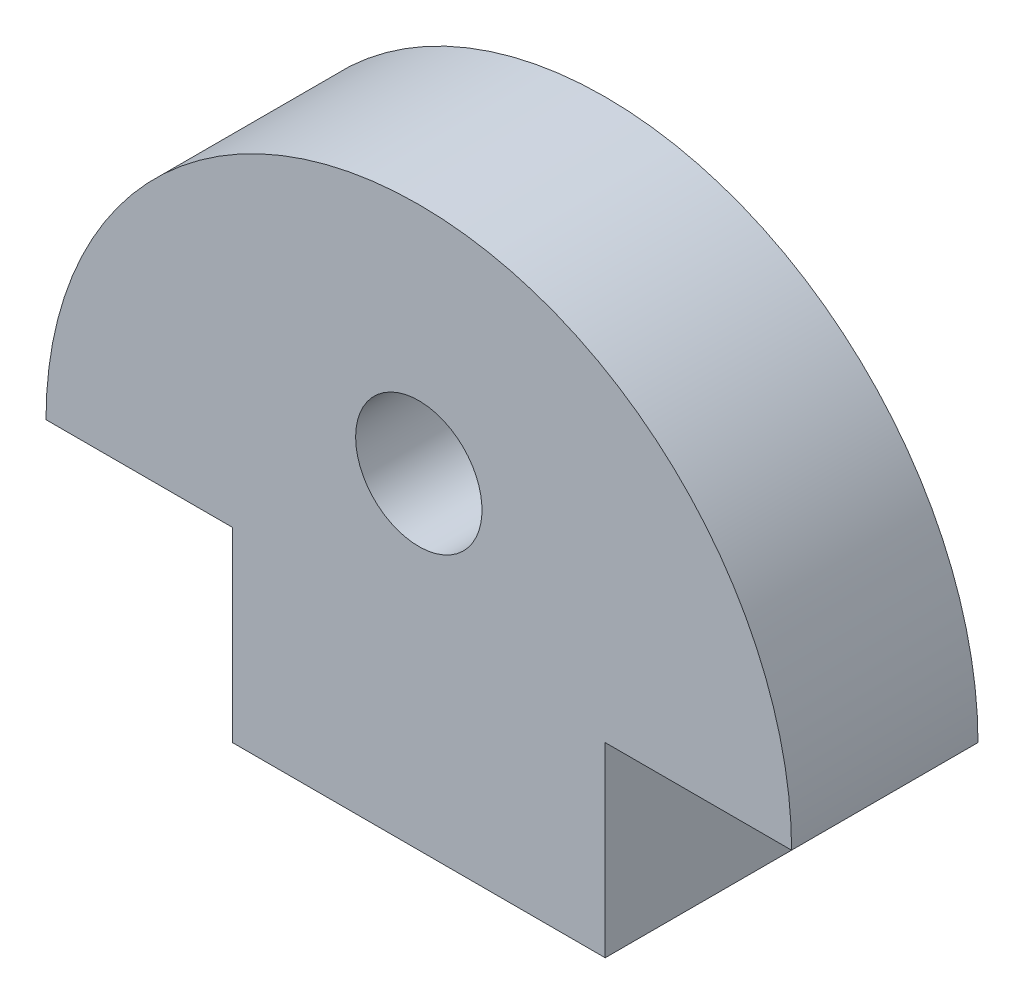
ISO-10303-21;
HEADER;
FILE_DESCRIPTION(('STEP AP214'),'2;1');
FILE_NAME('part.step','',(''),(''),'','','');
FILE_SCHEMA(('AUTOMOTIVE_DESIGN { 1 0 10303 214 1 1 1 1 }'));
ENDSEC;
DATA;
#1=APPLICATION_CONTEXT('core data for automotive mechanical design processes');
#2=APPLICATION_PROTOCOL_DEFINITION('international standard','automotive_design',2000,#1);
#3=PRODUCT_CONTEXT('',#1,'mechanical');
#4=PRODUCT('Part','Part','',(#3));
#5=PRODUCT_RELATED_PRODUCT_CATEGORY('part','',(#4));
#6=PRODUCT_DEFINITION_FORMATION('','',#4);
#7=PRODUCT_DEFINITION_CONTEXT('part definition',#1,'design');
#8=PRODUCT_DEFINITION('design','',#6,#7);
#9=PRODUCT_DEFINITION_SHAPE('','',#8);
#10=(LENGTH_UNIT() NAMED_UNIT(*) SI_UNIT(.MILLI.,.METRE.));
#11=(NAMED_UNIT(*) PLANE_ANGLE_UNIT() SI_UNIT($,.RADIAN.));
#12=(NAMED_UNIT(*) SI_UNIT($,.STERADIAN.) SOLID_ANGLE_UNIT());
#13=UNCERTAINTY_MEASURE_WITH_UNIT(LENGTH_MEASURE(1.E-05),#10,'distance_accuracy_value','');
#14=(GEOMETRIC_REPRESENTATION_CONTEXT(3) GLOBAL_UNCERTAINTY_ASSIGNED_CONTEXT((#13)) GLOBAL_UNIT_ASSIGNED_CONTEXT((#10,
#11,#12)) REPRESENTATION_CONTEXT('',''));
#15=CARTESIAN_POINT('',(0.,0.,0.));
#16=DIRECTION('',(0.,0.,1.));
#17=DIRECTION('',(1.,0.,0.));
#18=AXIS2_PLACEMENT_3D('',#15,#16,#17);
#19=CARTESIAN_POINT('',(-12.7,-12.7,6.35));
#20=DIRECTION('',(0.,1.,0.));
#21=DIRECTION('',(0.,0.,1.));
#22=AXIS2_PLACEMENT_3D('',#19,#20,#21);
#23=PLANE('',#22);
#24=DIRECTION('',(1.,0.,0.));
#25=VECTOR('',#24,1.);
#26=CARTESIAN_POINT('',(-12.7,-12.7,0.));
#27=LINE('',#26,#25);
#28=CARTESIAN_POINT('',(-12.7,-12.7,0.));
#29=VERTEX_POINT('',#28);
#30=CARTESIAN_POINT('',(-6.35,-12.7,0.));
#31=VERTEX_POINT('',#30);
#32=EDGE_CURVE('E131',#29,#31,#27,.T.);
#33=ORIENTED_EDGE('',*,*,#32,.T.);
#34=DIRECTION('',(0.,0.,1.));
#35=VECTOR('',#34,1.);
#36=CARTESIAN_POINT('',(-6.35,-12.7,0.));
#37=LINE('',#36,#35);
#38=CARTESIAN_POINT('',(-6.35,-12.7,6.35));
#39=VERTEX_POINT('',#38);
#40=EDGE_CURVE('E55',#31,#39,#37,.T.);
#41=ORIENTED_EDGE('',*,*,#40,.T.);
#42=DIRECTION('',(1.,0.,0.));
#43=VECTOR('',#42,1.);
#44=CARTESIAN_POINT('',(-12.7,-12.7,6.35));
#45=LINE('',#44,#43);
#46=CARTESIAN_POINT('',(-12.7,-12.7,6.35));
#47=VERTEX_POINT('',#46);
#48=EDGE_CURVE('E132',#47,#39,#45,.T.);
#49=ORIENTED_EDGE('',*,*,#48,.F.);
#50=DIRECTION('',(0.,0.,-1.));
#51=VECTOR('',#50,1.);
#52=CARTESIAN_POINT('',(-12.7,-12.7,6.35));
#53=LINE('',#52,#51);
#54=EDGE_CURVE('E11',#47,#29,#53,.T.);
#55=ORIENTED_EDGE('',*,*,#54,.T.);
#56=EDGE_LOOP('',(#33,#41,#49,#55));
#57=FACE_BOUND('',#56,.T.);
#58=ADVANCED_FACE('F32',(#57),#23,.F.);
#59=CARTESIAN_POINT('',(0.,-12.7,6.35));
#60=DIRECTION('',(0.,0.,-1.));
#61=DIRECTION('',(-1.,0.,0.));
#62=AXIS2_PLACEMENT_3D('',#59,#60,#61);
#63=CYLINDRICAL_SURFACE('',#62,12.7);
#64=CARTESIAN_POINT('',(0.,-12.7,0.));
#65=DIRECTION('',(0.,0.,1.));
#66=DIRECTION('',(-1.,0.,0.));
#67=AXIS2_PLACEMENT_3D('',#64,#65,#66);
#68=CIRCLE('',#67,12.7);
#69=CARTESIAN_POINT('',(12.7,-12.7,0.));
#70=VERTEX_POINT('',#69);
#71=EDGE_CURVE('E127',#70,#29,#68,.T.);
#72=ORIENTED_EDGE('',*,*,#71,.T.);
#73=ORIENTED_EDGE('',*,*,#54,.F.);
#74=CARTESIAN_POINT('',(0.,-12.7,6.35));
#75=DIRECTION('',(0.,0.,1.));
#76=DIRECTION('',(-1.,0.,0.));
#77=AXIS2_PLACEMENT_3D('',#74,#75,#76);
#78=CIRCLE('',#77,12.7);
#79=CARTESIAN_POINT('',(12.7,-12.7,6.35));
#80=VERTEX_POINT('',#79);
#81=EDGE_CURVE('E128',#80,#47,#78,.T.);
#82=ORIENTED_EDGE('',*,*,#81,.F.);
#83=DIRECTION('',(0.,0.,-1.));
#84=VECTOR('',#83,1.);
#85=CARTESIAN_POINT('',(12.7,-12.7,6.35));
#86=LINE('',#85,#84);
#87=EDGE_CURVE('E40',#80,#70,#86,.T.);
#88=ORIENTED_EDGE('',*,*,#87,.T.);
#89=EDGE_LOOP('',(#72,#73,#82,#88));
#90=FACE_BOUND('',#89,.T.);
#91=ADVANCED_FACE('F34',(#90),#63,.T.);
#92=CARTESIAN_POINT('',(6.35,-12.7,6.35));
#93=VERTEX_POINT('',#92);
#94=EDGE_CURVE('E47',#93,#80,#45,.T.);
#95=ORIENTED_EDGE('',*,*,#94,.F.);
#96=DIRECTION('',(0.,0.,1.));
#97=VECTOR('',#96,1.);
#98=CARTESIAN_POINT('',(6.35,-12.7,0.));
#99=LINE('',#98,#97);
#100=CARTESIAN_POINT('',(6.35,-12.7,0.));
#101=VERTEX_POINT('',#100);
#102=EDGE_CURVE('E119',#101,#93,#99,.T.);
#103=ORIENTED_EDGE('',*,*,#102,.F.);
#104=EDGE_CURVE('E136',#101,#70,#27,.T.);
#105=ORIENTED_EDGE('',*,*,#104,.T.);
#106=ORIENTED_EDGE('',*,*,#87,.F.);
#107=EDGE_LOOP('',(#95,#103,#105,#106));
#108=FACE_BOUND('',#107,.T.);
#109=ADVANCED_FACE('F146',(#108),#23,.F.);
#110=CARTESIAN_POINT('',(0.,-12.7,6.35));
#111=DIRECTION('',(0.,0.,-1.));
#112=DIRECTION('',(-1.,0.,0.));
#113=AXIS2_PLACEMENT_3D('',#110,#111,#112);
#114=PLANE('',#113);
#115=CARTESIAN_POINT('',(0.,-7.9375,6.35));
#116=DIRECTION('',(0.,0.,-1.));
#117=DIRECTION('',(-1.,0.,0.));
#118=AXIS2_PLACEMENT_3D('',#115,#116,#117);
#119=CIRCLE('',#118,2.15265);
#120=CARTESIAN_POINT('',(-2.15265,-7.9375,6.35));
#121=VERTEX_POINT('',#120);
#122=EDGE_CURVE('E124',#121,#121,#119,.T.);
#123=ORIENTED_EDGE('',*,*,#122,.T.);
#124=EDGE_LOOP('',(#123));
#125=FACE_BOUND('',#124,.T.);
#126=ORIENTED_EDGE('',*,*,#81,.T.);
#127=ORIENTED_EDGE('',*,*,#48,.T.);
#128=DIRECTION('',(0.,-1.,0.));
#129=VECTOR('',#128,1.);
#130=CARTESIAN_POINT('',(-6.35,-12.7,6.35));
#131=LINE('',#130,#129);
#132=CARTESIAN_POINT('',(-6.35,-19.05,6.35));
#133=VERTEX_POINT('',#132);
#134=EDGE_CURVE('E114',#39,#133,#131,.T.);
#135=ORIENTED_EDGE('',*,*,#134,.T.);
#136=DIRECTION('',(1.,0.,0.));
#137=VECTOR('',#136,1.);
#138=CARTESIAN_POINT('',(-6.35,-19.05,6.35));
#139=LINE('',#138,#137);
#140=CARTESIAN_POINT('',(6.35,-19.05,6.35));
#141=VERTEX_POINT('',#140);
#142=EDGE_CURVE('E91',#133,#141,#139,.T.);
#143=ORIENTED_EDGE('',*,*,#142,.T.);
#144=DIRECTION('',(0.,1.,0.));
#145=VECTOR('',#144,1.);
#146=CARTESIAN_POINT('',(6.35,-12.7,6.35));
#147=LINE('',#146,#145);
#148=EDGE_CURVE('E108',#141,#93,#147,.T.);
#149=ORIENTED_EDGE('',*,*,#148,.T.);
#150=ORIENTED_EDGE('',*,*,#94,.T.);
#151=EDGE_LOOP('',(#126,#127,#135,#143,#149,#150));
#152=FACE_BOUND('',#151,.T.);
#153=ADVANCED_FACE('F142',(#125,#152),#114,.F.);
#154=CARTESIAN_POINT('',(0.,-12.7,0.));
#155=DIRECTION('',(0.,0.,-1.));
#156=DIRECTION('',(-1.,0.,0.));
#157=AXIS2_PLACEMENT_3D('',#154,#155,#156);
#158=PLANE('',#157);
#159=CARTESIAN_POINT('',(0.,-7.9375,0.));
#160=DIRECTION('',(0.,0.,-1.));
#161=DIRECTION('',(-1.,0.,0.));
#162=AXIS2_PLACEMENT_3D('',#159,#160,#161);
#163=CIRCLE('',#162,2.15264999999999);
#164=CARTESIAN_POINT('',(-2.15264999999999,-7.9375,0.));
#165=VERTEX_POINT('',#164);
#166=EDGE_CURVE('E118',#165,#165,#163,.T.);
#167=ORIENTED_EDGE('',*,*,#166,.F.);
#168=EDGE_LOOP('',(#167));
#169=FACE_BOUND('',#168,.T.);
#170=ORIENTED_EDGE('',*,*,#71,.F.);
#171=ORIENTED_EDGE('',*,*,#104,.F.);
#172=DIRECTION('',(0.,1.,0.));
#173=VECTOR('',#172,1.);
#174=CARTESIAN_POINT('',(6.35,-12.7,0.));
#175=LINE('',#174,#173);
#176=CARTESIAN_POINT('',(6.35,-19.05,0.));
#177=VERTEX_POINT('',#176);
#178=EDGE_CURVE('E97',#177,#101,#175,.T.);
#179=ORIENTED_EDGE('',*,*,#178,.F.);
#180=DIRECTION('',(1.,0.,0.));
#181=VECTOR('',#180,1.);
#182=CARTESIAN_POINT('',(-6.35,-19.05,0.));
#183=LINE('',#182,#181);
#184=CARTESIAN_POINT('',(-6.35,-19.05,0.));
#185=VERTEX_POINT('',#184);
#186=EDGE_CURVE('E89',#185,#177,#183,.T.);
#187=ORIENTED_EDGE('',*,*,#186,.F.);
#188=DIRECTION('',(0.,-1.,0.));
#189=VECTOR('',#188,1.);
#190=CARTESIAN_POINT('',(-6.35,-12.7,0.));
#191=LINE('',#190,#189);
#192=EDGE_CURVE('E104',#31,#185,#191,.T.);
#193=ORIENTED_EDGE('',*,*,#192,.F.);
#194=ORIENTED_EDGE('',*,*,#32,.F.);
#195=EDGE_LOOP('',(#170,#171,#179,#187,#193,#194));
#196=FACE_BOUND('',#195,.T.);
#197=ADVANCED_FACE('F103',(#169,#196),#158,.T.);
#198=CARTESIAN_POINT('',(0.,-7.9375,0.));
#199=DIRECTION('',(0.,0.,-1.));
#200=DIRECTION('',(-1.,0.,0.));
#201=AXIS2_PLACEMENT_3D('',#198,#199,#200);
#202=CYLINDRICAL_SURFACE('',#201,2.15264999999999);
#203=ORIENTED_EDGE('',*,*,#122,.F.);
#204=EDGE_LOOP('',(#203));
#205=FACE_BOUND('',#204,.T.);
#206=ORIENTED_EDGE('',*,*,#166,.T.);
#207=EDGE_LOOP('',(#206));
#208=FACE_BOUND('',#207,.T.);
#209=ADVANCED_FACE('F168',(#205,#208),#202,.F.);
#210=CARTESIAN_POINT('',(-6.35,-12.7,0.));
#211=DIRECTION('',(-1.,0.,0.));
#212=DIRECTION('',(0.,-1.,0.));
#213=AXIS2_PLACEMENT_3D('',#210,#211,#212);
#214=PLANE('',#213);
#215=ORIENTED_EDGE('',*,*,#134,.F.);
#216=ORIENTED_EDGE('',*,*,#40,.F.);
#217=ORIENTED_EDGE('',*,*,#192,.T.);
#218=DIRECTION('',(0.,0.,1.));
#219=VECTOR('',#218,1.);
#220=CARTESIAN_POINT('',(-6.35,-19.05,0.));
#221=LINE('',#220,#219);
#222=EDGE_CURVE('E86',#185,#133,#221,.T.);
#223=ORIENTED_EDGE('',*,*,#222,.T.);
#224=EDGE_LOOP('',(#215,#216,#217,#223));
#225=FACE_BOUND('',#224,.T.);
#226=ADVANCED_FACE('F107',(#225),#214,.T.);
#227=CARTESIAN_POINT('',(6.35,-12.7,0.));
#228=DIRECTION('',(1.,0.,0.));
#229=DIRECTION('',(0.,1.,0.));
#230=AXIS2_PLACEMENT_3D('',#227,#228,#229);
#231=PLANE('',#230);
#232=ORIENTED_EDGE('',*,*,#148,.F.);
#233=DIRECTION('',(0.,0.,1.));
#234=VECTOR('',#233,1.);
#235=CARTESIAN_POINT('',(6.35,-19.05,0.));
#236=LINE('',#235,#234);
#237=EDGE_CURVE('E96',#177,#141,#236,.T.);
#238=ORIENTED_EDGE('',*,*,#237,.F.);
#239=ORIENTED_EDGE('',*,*,#178,.T.);
#240=ORIENTED_EDGE('',*,*,#102,.T.);
#241=EDGE_LOOP('',(#232,#238,#239,#240));
#242=FACE_BOUND('',#241,.T.);
#243=ADVANCED_FACE('F145',(#242),#231,.T.);
#244=CARTESIAN_POINT('',(-6.35,-19.05,0.));
#245=DIRECTION('',(0.,-1.,0.));
#246=DIRECTION('',(0.,0.,-1.));
#247=AXIS2_PLACEMENT_3D('',#244,#245,#246);
#248=PLANE('',#247);
#249=ORIENTED_EDGE('',*,*,#142,.F.);
#250=ORIENTED_EDGE('',*,*,#222,.F.);
#251=ORIENTED_EDGE('',*,*,#186,.T.);
#252=ORIENTED_EDGE('',*,*,#237,.T.);
#253=EDGE_LOOP('',(#249,#250,#251,#252));
#254=FACE_BOUND('',#253,.T.);
#255=ADVANCED_FACE('F88',(#254),#248,.T.);
#256=CLOSED_SHELL('',(#58,#91,#109,#153,#197,#209,#226,#243,#255));
#257=MANIFOLD_SOLID_BREP('B2',#256);
#258=ADVANCED_BREP_SHAPE_REPRESENTATION('',(#18,#257),#14);
#259=SHAPE_DEFINITION_REPRESENTATION(#9,#258);
ENDSEC;
END-ISO-10303-21;
